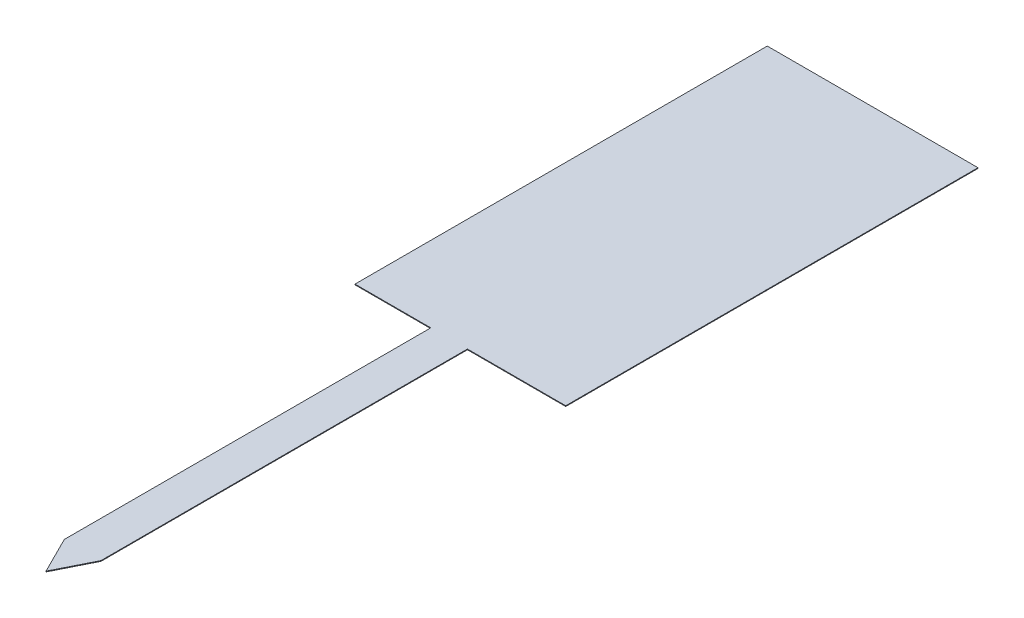
ISO-10303-21;
HEADER;
FILE_DESCRIPTION(('STEP AP214'),'2;1');
FILE_NAME('part.step','',(''),(''),'','','');
FILE_SCHEMA(('AUTOMOTIVE_DESIGN { 1 0 10303 214 1 1 1 1 }'));
ENDSEC;
DATA;
#1=APPLICATION_CONTEXT('core data for automotive mechanical design processes');
#2=APPLICATION_PROTOCOL_DEFINITION('international standard','automotive_design',2000,#1);
#3=PRODUCT_CONTEXT('',#1,'mechanical');
#4=PRODUCT('Part','Part','',(#3));
#5=PRODUCT_RELATED_PRODUCT_CATEGORY('part','',(#4));
#6=PRODUCT_DEFINITION_FORMATION('','',#4);
#7=PRODUCT_DEFINITION_CONTEXT('part definition',#1,'design');
#8=PRODUCT_DEFINITION('design','',#6,#7);
#9=PRODUCT_DEFINITION_SHAPE('','',#8);
#10=(LENGTH_UNIT() NAMED_UNIT(*) SI_UNIT(.MILLI.,.METRE.));
#11=(NAMED_UNIT(*) PLANE_ANGLE_UNIT() SI_UNIT($,.RADIAN.));
#12=(NAMED_UNIT(*) SI_UNIT($,.STERADIAN.) SOLID_ANGLE_UNIT());
#13=UNCERTAINTY_MEASURE_WITH_UNIT(LENGTH_MEASURE(1.E-05),#10,'distance_accuracy_value','');
#14=(GEOMETRIC_REPRESENTATION_CONTEXT(3) GLOBAL_UNCERTAINTY_ASSIGNED_CONTEXT((#13)) GLOBAL_UNIT_ASSIGNED_CONTEXT((#10,
#11,#12)) REPRESENTATION_CONTEXT('',''));
#15=CARTESIAN_POINT('',(0.,0.,0.));
#16=DIRECTION('',(0.,0.,1.));
#17=DIRECTION('',(1.,0.,0.));
#18=AXIS2_PLACEMENT_3D('',#15,#16,#17);
#19=CARTESIAN_POINT('',(-2.00000000000001,0.0749999999999998,62.5));
#20=DIRECTION('',(-1.,0.,0.));
#21=DIRECTION('',(0.,0.,1.));
#22=AXIS2_PLACEMENT_3D('',#19,#20,#21);
#23=PLANE('',#22);
#24=DIRECTION('',(0.,0.,-1.));
#25=VECTOR('',#24,1.);
#26=CARTESIAN_POINT('',(-2.00000000000001,0.,62.5));
#27=LINE('',#26,#25);
#28=CARTESIAN_POINT('',(-2.00000000000001,0.,62.5));
#29=VERTEX_POINT('',#28);
#30=CARTESIAN_POINT('',(-2.00000000000001,0.,22.5));
#31=VERTEX_POINT('',#30);
#32=EDGE_CURVE('E142',#29,#31,#27,.T.);
#33=ORIENTED_EDGE('',*,*,#32,.F.);
#34=DIRECTION('',(0.,-1.,0.));
#35=VECTOR('',#34,1.);
#36=CARTESIAN_POINT('',(-2.00000000000001,0.0749999999999998,62.5));
#37=LINE('',#36,#35);
#38=CARTESIAN_POINT('',(-2.00000000000001,0.0749999999999998,62.5));
#39=VERTEX_POINT('',#38);
#40=EDGE_CURVE('E11',#39,#29,#37,.T.);
#41=ORIENTED_EDGE('',*,*,#40,.F.);
#42=DIRECTION('',(0.,0.,-1.));
#43=VECTOR('',#42,1.);
#44=CARTESIAN_POINT('',(-2.00000000000001,0.0749999999999998,62.5));
#45=LINE('',#44,#43);
#46=CARTESIAN_POINT('',(-2.00000000000001,0.0749999999999998,22.5));
#47=VERTEX_POINT('',#46);
#48=EDGE_CURVE('E165',#39,#47,#45,.T.);
#49=ORIENTED_EDGE('',*,*,#48,.T.);
#50=DIRECTION('',(0.,-1.,0.));
#51=VECTOR('',#50,1.);
#52=CARTESIAN_POINT('',(-2.00000000000001,0.0749999999999998,22.5));
#53=LINE('',#52,#51);
#54=EDGE_CURVE('E42',#47,#31,#53,.T.);
#55=ORIENTED_EDGE('',*,*,#54,.T.);
#56=EDGE_LOOP('',(#33,#41,#49,#55));
#57=FACE_BOUND('',#56,.T.);
#58=ADVANCED_FACE('F39',(#57),#23,.T.);
#59=CARTESIAN_POINT('',(0.,0.0749999999999998,66.5));
#60=DIRECTION('',(-0.894427190999915,0.,0.447213595499959));
#61=DIRECTION('',(0.447213595499959,0.,0.894427190999916));
#62=AXIS2_PLACEMENT_3D('',#59,#60,#61);
#63=PLANE('',#62);
#64=DIRECTION('',(-0.447213595499959,0.,-0.894427190999916));
#65=VECTOR('',#64,1.);
#66=CARTESIAN_POINT('',(0.,0.,66.5));
#67=LINE('',#66,#65);
#68=CARTESIAN_POINT('',(0.,0.,66.5));
#69=VERTEX_POINT('',#68);
#70=EDGE_CURVE('E163',#69,#29,#67,.T.);
#71=ORIENTED_EDGE('',*,*,#70,.F.);
#72=DIRECTION('',(0.,-1.,0.));
#73=VECTOR('',#72,1.);
#74=CARTESIAN_POINT('',(0.,0.0749999999999998,66.5));
#75=LINE('',#74,#73);
#76=CARTESIAN_POINT('',(0.,0.0749999999999998,66.5));
#77=VERTEX_POINT('',#76);
#78=EDGE_CURVE('E48',#77,#69,#75,.T.);
#79=ORIENTED_EDGE('',*,*,#78,.F.);
#80=DIRECTION('',(-0.447213595499959,0.,-0.894427190999916));
#81=VECTOR('',#80,1.);
#82=CARTESIAN_POINT('',(0.,0.0749999999999998,66.5));
#83=LINE('',#82,#81);
#84=EDGE_CURVE('E132',#77,#39,#83,.T.);
#85=ORIENTED_EDGE('',*,*,#84,.T.);
#86=ORIENTED_EDGE('',*,*,#40,.T.);
#87=EDGE_LOOP('',(#71,#79,#85,#86));
#88=FACE_BOUND('',#87,.T.);
#89=ADVANCED_FACE('F179',(#88),#63,.T.);
#90=CARTESIAN_POINT('',(2.,0.0749999999999998,62.5));
#91=DIRECTION('',(0.894427190999916,0.,0.447213595499958));
#92=DIRECTION('',(0.447213595499958,0.,-0.894427190999916));
#93=AXIS2_PLACEMENT_3D('',#90,#91,#92);
#94=PLANE('',#93);
#95=DIRECTION('',(-0.447213595499957,0.,0.894427190999916));
#96=VECTOR('',#95,1.);
#97=CARTESIAN_POINT('',(2.,0.,62.5));
#98=LINE('',#97,#96);
#99=CARTESIAN_POINT('',(2.,0.,62.5));
#100=VERTEX_POINT('',#99);
#101=EDGE_CURVE('E119',#100,#69,#98,.T.);
#102=ORIENTED_EDGE('',*,*,#101,.F.);
#103=DIRECTION('',(0.,-1.,0.));
#104=VECTOR('',#103,1.);
#105=CARTESIAN_POINT('',(2.,0.0749999999999998,62.5));
#106=LINE('',#105,#104);
#107=CARTESIAN_POINT('',(2.,0.0749999999999998,62.5));
#108=VERTEX_POINT('',#107);
#109=EDGE_CURVE('E114',#108,#100,#106,.T.);
#110=ORIENTED_EDGE('',*,*,#109,.F.);
#111=DIRECTION('',(-0.447213595499957,0.,0.894427190999916));
#112=VECTOR('',#111,1.);
#113=CARTESIAN_POINT('',(2.,0.0749999999999998,62.5));
#114=LINE('',#113,#112);
#115=EDGE_CURVE('E117',#108,#77,#114,.T.);
#116=ORIENTED_EDGE('',*,*,#115,.T.);
#117=ORIENTED_EDGE('',*,*,#78,.T.);
#118=EDGE_LOOP('',(#102,#110,#116,#117));
#119=FACE_BOUND('',#118,.T.);
#120=ADVANCED_FACE('F116',(#119),#94,.T.);
#121=CARTESIAN_POINT('',(1.99999999999999,0.0749999999999998,22.5));
#122=DIRECTION('',(1.,0.,0.));
#123=DIRECTION('',(0.,0.,-1.));
#124=AXIS2_PLACEMENT_3D('',#121,#122,#123);
#125=PLANE('',#124);
#126=DIRECTION('',(0.,0.,1.));
#127=VECTOR('',#126,1.);
#128=CARTESIAN_POINT('',(1.99999999999999,0.,22.5));
#129=LINE('',#128,#127);
#130=CARTESIAN_POINT('',(1.99999999999999,0.,22.5));
#131=VERTEX_POINT('',#130);
#132=EDGE_CURVE('E160',#131,#100,#129,.T.);
#133=ORIENTED_EDGE('',*,*,#132,.F.);
#134=DIRECTION('',(0.,-1.,0.));
#135=VECTOR('',#134,1.);
#136=CARTESIAN_POINT('',(1.99999999999999,0.0749999999999998,22.5));
#137=LINE('',#136,#135);
#138=CARTESIAN_POINT('',(1.99999999999999,0.0749999999999998,22.5));
#139=VERTEX_POINT('',#138);
#140=EDGE_CURVE('E124',#139,#131,#137,.T.);
#141=ORIENTED_EDGE('',*,*,#140,.F.);
#142=DIRECTION('',(0.,0.,1.));
#143=VECTOR('',#142,1.);
#144=CARTESIAN_POINT('',(1.99999999999999,0.0749999999999998,22.5));
#145=LINE('',#144,#143);
#146=EDGE_CURVE('E130',#139,#108,#145,.T.);
#147=ORIENTED_EDGE('',*,*,#146,.T.);
#148=ORIENTED_EDGE('',*,*,#109,.T.);
#149=EDGE_LOOP('',(#133,#141,#147,#148));
#150=FACE_BOUND('',#149,.T.);
#151=ADVANCED_FACE('F134',(#150),#125,.T.);
#152=CARTESIAN_POINT('',(12.7263694374112,0.0749999999999998,22.5));
#153=DIRECTION('',(0.,0.,1.));
#154=DIRECTION('',(1.,0.,0.));
#155=AXIS2_PLACEMENT_3D('',#152,#153,#154);
#156=PLANE('',#155);
#157=DIRECTION('',(-1.,0.,0.));
#158=VECTOR('',#157,1.);
#159=CARTESIAN_POINT('',(12.7263694374112,0.,22.5));
#160=LINE('',#159,#158);
#161=CARTESIAN_POINT('',(12.7263694374112,0.,22.5));
#162=VERTEX_POINT('',#161);
#163=EDGE_CURVE('E157',#162,#131,#160,.T.);
#164=ORIENTED_EDGE('',*,*,#163,.F.);
#165=DIRECTION('',(0.,-1.,0.));
#166=VECTOR('',#165,1.);
#167=CARTESIAN_POINT('',(12.7263694374112,0.0749999999999998,22.5));
#168=LINE('',#167,#166);
#169=CARTESIAN_POINT('',(12.7263694374112,0.0749999999999998,22.5));
#170=VERTEX_POINT('',#169);
#171=EDGE_CURVE('E169',#170,#162,#168,.T.);
#172=ORIENTED_EDGE('',*,*,#171,.F.);
#173=DIRECTION('',(-1.,0.,0.));
#174=VECTOR('',#173,1.);
#175=CARTESIAN_POINT('',(12.7263694374112,0.0749999999999998,22.5));
#176=LINE('',#175,#174);
#177=EDGE_CURVE('E135',#170,#139,#176,.T.);
#178=ORIENTED_EDGE('',*,*,#177,.T.);
#179=ORIENTED_EDGE('',*,*,#140,.T.);
#180=EDGE_LOOP('',(#164,#172,#178,#179));
#181=FACE_BOUND('',#180,.T.);
#182=ADVANCED_FACE('F192',(#181),#156,.T.);
#183=CARTESIAN_POINT('',(12.7263694374112,0.0749999999999998,-22.5));
#184=DIRECTION('',(1.,0.,0.));
#185=DIRECTION('',(0.,0.,-1.));
#186=AXIS2_PLACEMENT_3D('',#183,#184,#185);
#187=PLANE('',#186);
#188=DIRECTION('',(0.,0.,1.));
#189=VECTOR('',#188,1.);
#190=CARTESIAN_POINT('',(12.7263694374112,0.,-22.5));
#191=LINE('',#190,#189);
#192=CARTESIAN_POINT('',(12.7263694374112,0.,-22.5));
#193=VERTEX_POINT('',#192);
#194=EDGE_CURVE('E154',#193,#162,#191,.T.);
#195=ORIENTED_EDGE('',*,*,#194,.F.);
#196=DIRECTION('',(0.,-1.,0.));
#197=VECTOR('',#196,1.);
#198=CARTESIAN_POINT('',(12.7263694374112,0.0749999999999998,-22.5));
#199=LINE('',#198,#197);
#200=CARTESIAN_POINT('',(12.7263694374112,0.0749999999999998,-22.5));
#201=VERTEX_POINT('',#200);
#202=EDGE_CURVE('E171',#201,#193,#199,.T.);
#203=ORIENTED_EDGE('',*,*,#202,.F.);
#204=DIRECTION('',(0.,0.,1.));
#205=VECTOR('',#204,1.);
#206=CARTESIAN_POINT('',(12.7263694374112,0.0749999999999998,-22.5));
#207=LINE('',#206,#205);
#208=EDGE_CURVE('E137',#201,#170,#207,.T.);
#209=ORIENTED_EDGE('',*,*,#208,.T.);
#210=ORIENTED_EDGE('',*,*,#171,.T.);
#211=EDGE_LOOP('',(#195,#203,#209,#210));
#212=FACE_BOUND('',#211,.T.);
#213=ADVANCED_FACE('F195',(#212),#187,.T.);
#214=CARTESIAN_POINT('',(-10.2736305625888,0.0749999999999998,-22.5));
#215=DIRECTION('',(0.,0.,-1.));
#216=DIRECTION('',(-1.,0.,0.));
#217=AXIS2_PLACEMENT_3D('',#214,#215,#216);
#218=PLANE('',#217);
#219=DIRECTION('',(1.,0.,0.));
#220=VECTOR('',#219,1.);
#221=CARTESIAN_POINT('',(-10.2736305625888,0.,-22.5));
#222=LINE('',#221,#220);
#223=CARTESIAN_POINT('',(-10.2736305625888,0.,-22.5));
#224=VERTEX_POINT('',#223);
#225=EDGE_CURVE('E151',#224,#193,#222,.T.);
#226=ORIENTED_EDGE('',*,*,#225,.F.);
#227=DIRECTION('',(0.,-1.,0.));
#228=VECTOR('',#227,1.);
#229=CARTESIAN_POINT('',(-10.2736305625888,0.0749999999999998,-22.5));
#230=LINE('',#229,#228);
#231=CARTESIAN_POINT('',(-10.2736305625888,0.0749999999999998,-22.5));
#232=VERTEX_POINT('',#231);
#233=EDGE_CURVE('E173',#232,#224,#230,.T.);
#234=ORIENTED_EDGE('',*,*,#233,.F.);
#235=DIRECTION('',(1.,0.,0.));
#236=VECTOR('',#235,1.);
#237=CARTESIAN_POINT('',(-10.2736305625888,0.0749999999999998,-22.5));
#238=LINE('',#237,#236);
#239=EDGE_CURVE('E280',#232,#201,#238,.T.);
#240=ORIENTED_EDGE('',*,*,#239,.T.);
#241=ORIENTED_EDGE('',*,*,#202,.T.);
#242=EDGE_LOOP('',(#226,#234,#240,#241));
#243=FACE_BOUND('',#242,.T.);
#244=ADVANCED_FACE('F199',(#243),#218,.T.);
#245=CARTESIAN_POINT('',(-10.2736305625888,0.0749999999999998,22.5));
#246=DIRECTION('',(-1.,0.,0.));
#247=DIRECTION('',(0.,0.,1.));
#248=AXIS2_PLACEMENT_3D('',#245,#246,#247);
#249=PLANE('',#248);
#250=DIRECTION('',(0.,0.,-1.));
#251=VECTOR('',#250,1.);
#252=CARTESIAN_POINT('',(-10.2736305625888,0.,22.5));
#253=LINE('',#252,#251);
#254=CARTESIAN_POINT('',(-10.2736305625888,0.,22.5));
#255=VERTEX_POINT('',#254);
#256=EDGE_CURVE('E148',#255,#224,#253,.T.);
#257=ORIENTED_EDGE('',*,*,#256,.F.);
#258=DIRECTION('',(0.,-1.,0.));
#259=VECTOR('',#258,1.);
#260=CARTESIAN_POINT('',(-10.2736305625888,0.0749999999999998,22.5));
#261=LINE('',#260,#259);
#262=CARTESIAN_POINT('',(-10.2736305625888,0.0749999999999998,22.5));
#263=VERTEX_POINT('',#262);
#264=EDGE_CURVE('E174',#263,#255,#261,.T.);
#265=ORIENTED_EDGE('',*,*,#264,.F.);
#266=DIRECTION('',(0.,0.,-1.));
#267=VECTOR('',#266,1.);
#268=CARTESIAN_POINT('',(-10.2736305625888,0.0749999999999998,22.5));
#269=LINE('',#268,#267);
#270=EDGE_CURVE('E284',#263,#232,#269,.T.);
#271=ORIENTED_EDGE('',*,*,#270,.T.);
#272=ORIENTED_EDGE('',*,*,#233,.T.);
#273=EDGE_LOOP('',(#257,#265,#271,#272));
#274=FACE_BOUND('',#273,.T.);
#275=ADVANCED_FACE('F203',(#274),#249,.T.);
#276=CARTESIAN_POINT('',(-2.00000000000001,0.0749999999999998,22.5));
#277=DIRECTION('',(0.,0.,1.));
#278=DIRECTION('',(1.,0.,0.));
#279=AXIS2_PLACEMENT_3D('',#276,#277,#278);
#280=PLANE('',#279);
#281=DIRECTION('',(-1.,0.,0.));
#282=VECTOR('',#281,1.);
#283=CARTESIAN_POINT('',(-2.00000000000001,0.,22.5));
#284=LINE('',#283,#282);
#285=EDGE_CURVE('E145',#31,#255,#284,.T.);
#286=ORIENTED_EDGE('',*,*,#285,.F.);
#287=ORIENTED_EDGE('',*,*,#54,.F.);
#288=DIRECTION('',(-1.,0.,0.));
#289=VECTOR('',#288,1.);
#290=CARTESIAN_POINT('',(-2.00000000000001,0.0749999999999998,22.5));
#291=LINE('',#290,#289);
#292=EDGE_CURVE('E288',#47,#263,#291,.T.);
#293=ORIENTED_EDGE('',*,*,#292,.T.);
#294=ORIENTED_EDGE('',*,*,#264,.T.);
#295=EDGE_LOOP('',(#286,#287,#293,#294));
#296=FACE_BOUND('',#295,.T.);
#297=ADVANCED_FACE('F176',(#296),#280,.T.);
#298=CARTESIAN_POINT('',(0.,0.0749999999999998,0.));
#299=DIRECTION('',(0.,1.,0.));
#300=DIRECTION('',(0.,0.,1.));
#301=AXIS2_PLACEMENT_3D('',#298,#299,#300);
#302=PLANE('',#301);
#303=ORIENTED_EDGE('',*,*,#48,.F.);
#304=ORIENTED_EDGE('',*,*,#84,.F.);
#305=ORIENTED_EDGE('',*,*,#115,.F.);
#306=ORIENTED_EDGE('',*,*,#146,.F.);
#307=ORIENTED_EDGE('',*,*,#177,.F.);
#308=ORIENTED_EDGE('',*,*,#208,.F.);
#309=ORIENTED_EDGE('',*,*,#239,.F.);
#310=ORIENTED_EDGE('',*,*,#270,.F.);
#311=ORIENTED_EDGE('',*,*,#292,.F.);
#312=EDGE_LOOP('',(#303,#304,#305,#306,#307,#308,#309,#310,#311));
#313=FACE_BOUND('',#312,.T.);
#314=ADVANCED_FACE('F128',(#313),#302,.T.);
#315=CARTESIAN_POINT('',(0.,0.,0.));
#316=DIRECTION('',(0.,1.,0.));
#317=DIRECTION('',(0.,0.,1.));
#318=AXIS2_PLACEMENT_3D('',#315,#316,#317);
#319=PLANE('',#318);
#320=ORIENTED_EDGE('',*,*,#32,.T.);
#321=ORIENTED_EDGE('',*,*,#285,.T.);
#322=ORIENTED_EDGE('',*,*,#256,.T.);
#323=ORIENTED_EDGE('',*,*,#225,.T.);
#324=ORIENTED_EDGE('',*,*,#194,.T.);
#325=ORIENTED_EDGE('',*,*,#163,.T.);
#326=ORIENTED_EDGE('',*,*,#132,.T.);
#327=ORIENTED_EDGE('',*,*,#101,.T.);
#328=ORIENTED_EDGE('',*,*,#70,.T.);
#329=EDGE_LOOP('',(#320,#321,#322,#323,#324,#325,#326,#327,#328));
#330=FACE_BOUND('',#329,.T.);
#331=ADVANCED_FACE('F178',(#330),#319,.F.);
#332=CLOSED_SHELL('',(#58,#89,#120,#151,#182,#213,#244,#275,#297,#314,#331));
#333=MANIFOLD_SOLID_BREP('B2',#332);
#334=ADVANCED_BREP_SHAPE_REPRESENTATION('',(#18,#333),#14);
#335=SHAPE_DEFINITION_REPRESENTATION(#9,#334);
ENDSEC;
END-ISO-10303-21;
